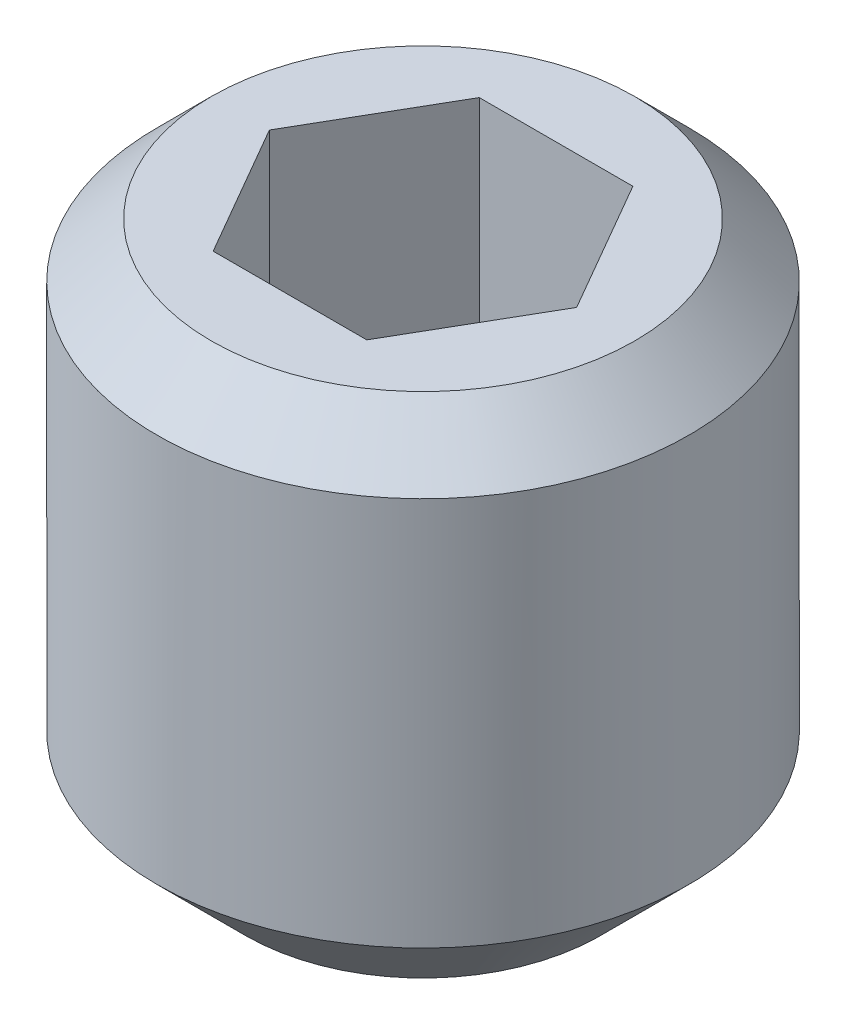
ISO-10303-21;
HEADER;
FILE_DESCRIPTION(('STEP AP214'),'2;1');
FILE_NAME('part.step','',(''),(''),'','','');
FILE_SCHEMA(('AUTOMOTIVE_DESIGN { 1 0 10303 214 1 1 1 1 }'));
ENDSEC;
DATA;
#1=APPLICATION_CONTEXT('core data for automotive mechanical design processes');
#2=APPLICATION_PROTOCOL_DEFINITION('international standard','automotive_design',2000,#1);
#3=PRODUCT_CONTEXT('',#1,'mechanical');
#4=PRODUCT('Part','Part','',(#3));
#5=PRODUCT_RELATED_PRODUCT_CATEGORY('part','',(#4));
#6=PRODUCT_DEFINITION_FORMATION('','',#4);
#7=PRODUCT_DEFINITION_CONTEXT('part definition',#1,'design');
#8=PRODUCT_DEFINITION('design','',#6,#7);
#9=PRODUCT_DEFINITION_SHAPE('','',#8);
#10=(LENGTH_UNIT() NAMED_UNIT(*) SI_UNIT(.MILLI.,.METRE.));
#11=(NAMED_UNIT(*) PLANE_ANGLE_UNIT() SI_UNIT($,.RADIAN.));
#12=(NAMED_UNIT(*) SI_UNIT($,.STERADIAN.) SOLID_ANGLE_UNIT());
#13=UNCERTAINTY_MEASURE_WITH_UNIT(LENGTH_MEASURE(1.E-05),#10,'distance_accuracy_value','');
#14=(GEOMETRIC_REPRESENTATION_CONTEXT(3) GLOBAL_UNCERTAINTY_ASSIGNED_CONTEXT((#13)) GLOBAL_UNIT_ASSIGNED_CONTEXT((#10,
#11,#12)) REPRESENTATION_CONTEXT('',''));
#15=CARTESIAN_POINT('',(0.,0.,0.));
#16=DIRECTION('',(0.,0.,1.));
#17=DIRECTION('',(1.,0.,0.));
#18=AXIS2_PLACEMENT_3D('',#15,#16,#17);
#19=CARTESIAN_POINT('',(0.,4.29999999983011,0.));
#20=DIRECTION('',(0.,1.,0.));
#21=DIRECTION('',(0.,0.,1.));
#22=AXIS2_PLACEMENT_3D('',#19,#20,#21);
#23=CONICAL_SURFACE('',#22,0.749999999811735,1.0471975507934);
#24=CARTESIAN_POINT('',(0.,4.29999999996138,0.));
#25=DIRECTION('',(0.,1.,0.));
#26=DIRECTION('',(0.,0.,1.));
#27=AXIS2_PLACEMENT_3D('',#24,#25,#26);
#28=CIRCLE('',#27,0.750000000039108);
#29=CARTESIAN_POINT('',(0.,4.29999999998069,0.750000000019554));
#30=VERTEX_POINT('',#29);
#31=CARTESIAN_POINT('',(-0.649519052855264,4.29999999998069,0.375000000009777));
#32=VERTEX_POINT('',#31);
#33=EDGE_CURVE('E141',#30,#32,#28,.F.);
#34=ORIENTED_EDGE('',*,*,#33,.F.);
#35=CARTESIAN_POINT('',(0.,4.29999999996138,0.));
#36=DIRECTION('',(0.,1.,0.));
#37=DIRECTION('',(0.,0.,1.));
#38=AXIS2_PLACEMENT_3D('',#35,#36,#37);
#39=CIRCLE('',#38,0.750000000039108);
#40=CARTESIAN_POINT('',(0.649519052855263,4.29999999998069,0.375000000009777));
#41=VERTEX_POINT('',#40);
#42=EDGE_CURVE('E144',#41,#30,#39,.F.);
#43=ORIENTED_EDGE('',*,*,#42,.F.);
#44=CARTESIAN_POINT('',(0.,4.29999999996138,0.));
#45=DIRECTION('',(0.,1.,0.));
#46=DIRECTION('',(0.,0.,1.));
#47=AXIS2_PLACEMENT_3D('',#44,#45,#46);
#48=CIRCLE('',#47,0.750000000039108);
#49=CARTESIAN_POINT('',(0.649519052855264,4.29999999998069,-0.375000000009777));
#50=VERTEX_POINT('',#49);
#51=EDGE_CURVE('E94',#50,#41,#48,.F.);
#52=ORIENTED_EDGE('',*,*,#51,.F.);
#53=CARTESIAN_POINT('',(0.,4.29999999996138,0.));
#54=DIRECTION('',(0.,1.,0.));
#55=DIRECTION('',(0.,0.,1.));
#56=AXIS2_PLACEMENT_3D('',#53,#54,#55);
#57=CIRCLE('',#56,0.750000000039108);
#58=CARTESIAN_POINT('',(0.,4.29999999998069,-0.750000000019554));
#59=VERTEX_POINT('',#58);
#60=EDGE_CURVE('E91',#59,#50,#57,.F.);
#61=ORIENTED_EDGE('',*,*,#60,.F.);
#62=CARTESIAN_POINT('',(0.,4.29999999996138,0.));
#63=DIRECTION('',(0.,1.,0.));
#64=DIRECTION('',(0.,0.,1.));
#65=AXIS2_PLACEMENT_3D('',#62,#63,#64);
#66=CIRCLE('',#65,0.750000000039108);
#67=CARTESIAN_POINT('',(-0.649519052855263,4.29999999998069,-0.375000000009777));
#68=VERTEX_POINT('',#67);
#69=EDGE_CURVE('E20',#68,#59,#66,.F.);
#70=ORIENTED_EDGE('',*,*,#69,.F.);
#71=CARTESIAN_POINT('',(0.,4.29999999996138,0.));
#72=DIRECTION('',(0.,1.,0.));
#73=DIRECTION('',(0.,0.,1.));
#74=AXIS2_PLACEMENT_3D('',#71,#72,#73);
#75=CIRCLE('',#74,0.750000000039108);
#76=EDGE_CURVE('E139',#32,#68,#75,.F.);
#77=ORIENTED_EDGE('',*,*,#76,.F.);
#78=EDGE_LOOP('',(#34,#43,#52,#61,#70,#77));
#79=FACE_BOUND('',#78,.T.);
#80=CARTESIAN_POINT('',(0.,3.86698729792556,2.55795384873636E-10));
#81=VERTEX_POINT('',#80);
#82=VERTEX_LOOP('',#81);
#83=FACE_BOUND('',#82,.T.);
#84=ADVANCED_FACE('F17',(#79,#83),#23,.F.);
#85=CARTESIAN_POINT('',(0.,4.3,0.));
#86=DIRECTION('',(0.,1.,0.));
#87=DIRECTION('',(0.,0.,1.));
#88=AXIS2_PLACEMENT_3D('',#85,#86,#87);
#89=PLANE('',#88);
#90=DIRECTION('',(-1.,0.,0.));
#91=VECTOR('',#90,1.);
#92=CARTESIAN_POINT('',(0.433012701892219,4.3,-0.75));
#93=LINE('',#92,#91);
#94=CARTESIAN_POINT('',(-0.433012701892219,4.3,-0.75));
#95=VERTEX_POINT('',#94);
#96=EDGE_CURVE('E102',#59,#95,#93,.T.);
#97=ORIENTED_EDGE('',*,*,#96,.T.);
#98=DIRECTION('',(-0.5,0.,0.866025403784439));
#99=VECTOR('',#98,1.);
#100=CARTESIAN_POINT('',(-0.433012701892219,4.3,-0.75));
#101=LINE('',#100,#99);
#102=EDGE_CURVE('E104',#95,#68,#101,.T.);
#103=ORIENTED_EDGE('',*,*,#102,.T.);
#104=ORIENTED_EDGE('',*,*,#69,.T.);
#105=EDGE_LOOP('',(#97,#103,#104));
#106=FACE_BOUND('',#105,.T.);
#107=ADVANCED_FACE('F100',(#106),#89,.T.);
#108=CARTESIAN_POINT('',(0.,4.3,0.));
#109=DIRECTION('',(0.,1.,0.));
#110=DIRECTION('',(0.,0.,1.));
#111=AXIS2_PLACEMENT_3D('',#108,#109,#110);
#112=PLANE('',#111);
#113=DIRECTION('',(-0.5,0.,-0.866025403784439));
#114=VECTOR('',#113,1.);
#115=CARTESIAN_POINT('',(0.866025403784439,4.3,0.));
#116=LINE('',#115,#114);
#117=CARTESIAN_POINT('',(0.43301270189222,4.3,-0.75));
#118=VERTEX_POINT('',#117);
#119=EDGE_CURVE('E110',#50,#118,#116,.T.);
#120=ORIENTED_EDGE('',*,*,#119,.T.);
#121=DIRECTION('',(-1.,0.,0.));
#122=VECTOR('',#121,1.);
#123=CARTESIAN_POINT('',(0.433012701892219,4.3,-0.75));
#124=LINE('',#123,#122);
#125=EDGE_CURVE('E107',#118,#59,#124,.T.);
#126=ORIENTED_EDGE('',*,*,#125,.T.);
#127=ORIENTED_EDGE('',*,*,#60,.T.);
#128=EDGE_LOOP('',(#120,#126,#127));
#129=FACE_BOUND('',#128,.T.);
#130=ADVANCED_FACE('F108',(#129),#112,.T.);
#131=CARTESIAN_POINT('',(0.,4.3,0.));
#132=DIRECTION('',(0.,1.,0.));
#133=DIRECTION('',(0.,0.,1.));
#134=AXIS2_PLACEMENT_3D('',#131,#132,#133);
#135=PLANE('',#134);
#136=DIRECTION('',(0.5,0.,-0.866025403784439));
#137=VECTOR('',#136,1.);
#138=CARTESIAN_POINT('',(0.433012701892219,4.3,0.75));
#139=LINE('',#138,#137);
#140=CARTESIAN_POINT('',(0.866025403784438,4.3,0.));
#141=VERTEX_POINT('',#140);
#142=EDGE_CURVE('E151',#41,#141,#139,.T.);
#143=ORIENTED_EDGE('',*,*,#142,.T.);
#144=DIRECTION('',(-0.5,0.,-0.866025403784439));
#145=VECTOR('',#144,1.);
#146=CARTESIAN_POINT('',(0.866025403784439,4.3,0.));
#147=LINE('',#146,#145);
#148=EDGE_CURVE('E153',#141,#50,#147,.T.);
#149=ORIENTED_EDGE('',*,*,#148,.T.);
#150=ORIENTED_EDGE('',*,*,#51,.T.);
#151=EDGE_LOOP('',(#143,#149,#150));
#152=FACE_BOUND('',#151,.T.);
#153=ADVANCED_FACE('F149',(#152),#135,.T.);
#154=CARTESIAN_POINT('',(0.,4.3,0.));
#155=DIRECTION('',(0.,1.,0.));
#156=DIRECTION('',(0.,0.,1.));
#157=AXIS2_PLACEMENT_3D('',#154,#155,#156);
#158=PLANE('',#157);
#159=DIRECTION('',(1.,0.,0.));
#160=VECTOR('',#159,1.);
#161=CARTESIAN_POINT('',(-0.433012701892219,4.3,0.75));
#162=LINE('',#161,#160);
#163=CARTESIAN_POINT('',(0.433012701892219,4.3,0.75));
#164=VERTEX_POINT('',#163);
#165=EDGE_CURVE('E160',#30,#164,#162,.T.);
#166=ORIENTED_EDGE('',*,*,#165,.T.);
#167=DIRECTION('',(0.5,0.,-0.866025403784439));
#168=VECTOR('',#167,1.);
#169=CARTESIAN_POINT('',(0.433012701892219,4.3,0.75));
#170=LINE('',#169,#168);
#171=EDGE_CURVE('E156',#164,#41,#170,.T.);
#172=ORIENTED_EDGE('',*,*,#171,.T.);
#173=ORIENTED_EDGE('',*,*,#42,.T.);
#174=EDGE_LOOP('',(#166,#172,#173));
#175=FACE_BOUND('',#174,.T.);
#176=ADVANCED_FACE('F157',(#175),#158,.T.);
#177=CARTESIAN_POINT('',(0.,4.3,0.));
#178=DIRECTION('',(0.,1.,0.));
#179=DIRECTION('',(0.,0.,1.));
#180=AXIS2_PLACEMENT_3D('',#177,#178,#179);
#181=PLANE('',#180);
#182=DIRECTION('',(0.5,0.,0.866025403784439));
#183=VECTOR('',#182,1.);
#184=CARTESIAN_POINT('',(-0.866025403784439,4.3,0.));
#185=LINE('',#184,#183);
#186=CARTESIAN_POINT('',(-0.43301270189222,4.3,0.75));
#187=VERTEX_POINT('',#186);
#188=EDGE_CURVE('E209',#32,#187,#185,.T.);
#189=ORIENTED_EDGE('',*,*,#188,.T.);
#190=DIRECTION('',(1.,0.,0.));
#191=VECTOR('',#190,1.);
#192=CARTESIAN_POINT('',(-0.433012701892219,4.3,0.75));
#193=LINE('',#192,#191);
#194=EDGE_CURVE('E211',#187,#30,#193,.T.);
#195=ORIENTED_EDGE('',*,*,#194,.T.);
#196=ORIENTED_EDGE('',*,*,#33,.T.);
#197=EDGE_LOOP('',(#189,#195,#196));
#198=FACE_BOUND('',#197,.T.);
#199=ADVANCED_FACE('F255',(#198),#181,.T.);
#200=CARTESIAN_POINT('',(0.,4.3,0.));
#201=DIRECTION('',(0.,1.,0.));
#202=DIRECTION('',(0.,0.,1.));
#203=AXIS2_PLACEMENT_3D('',#200,#201,#202);
#204=PLANE('',#203);
#205=DIRECTION('',(-0.5,0.,0.866025403784439));
#206=VECTOR('',#205,1.);
#207=CARTESIAN_POINT('',(-0.433012701892219,4.3,-0.75));
#208=LINE('',#207,#206);
#209=CARTESIAN_POINT('',(-0.866025403784439,4.3,0.));
#210=VERTEX_POINT('',#209);
#211=EDGE_CURVE('E120',#68,#210,#208,.T.);
#212=ORIENTED_EDGE('',*,*,#211,.T.);
#213=DIRECTION('',(0.5,0.,0.866025403784439));
#214=VECTOR('',#213,1.);
#215=CARTESIAN_POINT('',(-0.866025403784439,4.3,0.));
#216=LINE('',#215,#214);
#217=EDGE_CURVE('E203',#210,#32,#216,.T.);
#218=ORIENTED_EDGE('',*,*,#217,.T.);
#219=ORIENTED_EDGE('',*,*,#76,.T.);
#220=EDGE_LOOP('',(#212,#218,#219));
#221=FACE_BOUND('',#220,.T.);
#222=ADVANCED_FACE('F253',(#221),#204,.T.);
#223=CARTESIAN_POINT('',(-0.433012701892219,5.5,-0.75));
#224=DIRECTION('',(-0.866025403784439,0.,-0.5));
#225=DIRECTION('',(-0.5,0.,0.866025403784439));
#226=AXIS2_PLACEMENT_3D('',#223,#224,#225);
#227=PLANE('',#226);
#228=DIRECTION('',(0.,1.,0.));
#229=VECTOR('',#228,1.);
#230=CARTESIAN_POINT('',(-0.433012701892219,5.5,-0.75));
#231=LINE('',#230,#229);
#232=CARTESIAN_POINT('',(-0.433012701892219,5.5,-0.75));
#233=VERTEX_POINT('',#232);
#234=EDGE_CURVE('E113',#95,#233,#231,.T.);
#235=ORIENTED_EDGE('',*,*,#234,.T.);
#236=DIRECTION('',(0.500000000000001,0.,-0.866025403784438));
#237=VECTOR('',#236,1.);
#238=CARTESIAN_POINT('',(-0.866025403784439,5.5,0.));
#239=LINE('',#238,#237);
#240=CARTESIAN_POINT('',(-0.866025403784439,5.5,0.));
#241=VERTEX_POINT('',#240);
#242=EDGE_CURVE('E201',#241,#233,#239,.T.);
#243=ORIENTED_EDGE('',*,*,#242,.F.);
#244=DIRECTION('',(0.,1.,0.));
#245=VECTOR('',#244,1.);
#246=CARTESIAN_POINT('',(-0.866025403784439,5.5,0.));
#247=LINE('',#246,#245);
#248=EDGE_CURVE('E216',#241,#210,#247,.F.);
#249=ORIENTED_EDGE('',*,*,#248,.T.);
#250=ORIENTED_EDGE('',*,*,#211,.F.);
#251=ORIENTED_EDGE('',*,*,#102,.F.);
#252=EDGE_LOOP('',(#235,#243,#249,#250,#251));
#253=FACE_BOUND('',#252,.T.);
#254=ADVANCED_FACE('F251',(#253),#227,.F.);
#255=CARTESIAN_POINT('',(0.433012701892219,5.5,-0.75));
#256=DIRECTION('',(0.,0.,-1.));
#257=DIRECTION('',(-1.,0.,0.));
#258=AXIS2_PLACEMENT_3D('',#255,#256,#257);
#259=PLANE('',#258);
#260=DIRECTION('',(0.,1.,0.));
#261=VECTOR('',#260,1.);
#262=CARTESIAN_POINT('',(0.43301270189222,5.5,-0.75));
#263=LINE('',#262,#261);
#264=CARTESIAN_POINT('',(0.433012701892219,5.5,-0.75));
#265=VERTEX_POINT('',#264);
#266=EDGE_CURVE('E170',#118,#265,#263,.T.);
#267=ORIENTED_EDGE('',*,*,#266,.T.);
#268=DIRECTION('',(1.,0.,0.));
#269=VECTOR('',#268,1.);
#270=CARTESIAN_POINT('',(0.,5.5,-0.75));
#271=LINE('',#270,#269);
#272=EDGE_CURVE('E188',#233,#265,#271,.T.);
#273=ORIENTED_EDGE('',*,*,#272,.F.);
#274=ORIENTED_EDGE('',*,*,#234,.F.);
#275=ORIENTED_EDGE('',*,*,#96,.F.);
#276=ORIENTED_EDGE('',*,*,#125,.F.);
#277=EDGE_LOOP('',(#267,#273,#274,#275,#276));
#278=FACE_BOUND('',#277,.T.);
#279=ADVANCED_FACE('F116',(#278),#259,.F.);
#280=CARTESIAN_POINT('',(0.866025403784439,5.5,0.));
#281=DIRECTION('',(0.866025403784439,0.,-0.5));
#282=DIRECTION('',(-0.5,0.,-0.866025403784439));
#283=AXIS2_PLACEMENT_3D('',#280,#281,#282);
#284=PLANE('',#283);
#285=DIRECTION('',(0.,1.,0.));
#286=VECTOR('',#285,1.);
#287=CARTESIAN_POINT('',(0.866025403784438,5.5,0.));
#288=LINE('',#287,#286);
#289=CARTESIAN_POINT('',(0.866025403784439,5.5,0.));
#290=VERTEX_POINT('',#289);
#291=EDGE_CURVE('E163',#141,#290,#288,.T.);
#292=ORIENTED_EDGE('',*,*,#291,.T.);
#293=DIRECTION('',(0.500000000000001,0.,0.866025403784438));
#294=VECTOR('',#293,1.);
#295=CARTESIAN_POINT('',(0.433012701892219,5.5,-0.75));
#296=LINE('',#295,#294);
#297=EDGE_CURVE('E192',#265,#290,#296,.T.);
#298=ORIENTED_EDGE('',*,*,#297,.F.);
#299=ORIENTED_EDGE('',*,*,#266,.F.);
#300=ORIENTED_EDGE('',*,*,#119,.F.);
#301=ORIENTED_EDGE('',*,*,#148,.F.);
#302=EDGE_LOOP('',(#292,#298,#299,#300,#301));
#303=FACE_BOUND('',#302,.T.);
#304=ADVANCED_FACE('F193',(#303),#284,.F.);
#305=CARTESIAN_POINT('',(0.433012701892219,5.5,0.75));
#306=DIRECTION('',(0.866025403784439,0.,0.5));
#307=DIRECTION('',(0.5,0.,-0.866025403784439));
#308=AXIS2_PLACEMENT_3D('',#305,#306,#307);
#309=PLANE('',#308);
#310=DIRECTION('',(0.,1.,0.));
#311=VECTOR('',#310,1.);
#312=CARTESIAN_POINT('',(0.433012701892219,5.5,0.75));
#313=LINE('',#312,#311);
#314=CARTESIAN_POINT('',(0.433012701892219,5.5,0.75));
#315=VERTEX_POINT('',#314);
#316=EDGE_CURVE('E233',#164,#315,#313,.T.);
#317=ORIENTED_EDGE('',*,*,#316,.T.);
#318=DIRECTION('',(-0.500000000000001,0.,0.866025403784438));
#319=VECTOR('',#318,1.);
#320=CARTESIAN_POINT('',(0.866025403784439,5.5,0.));
#321=LINE('',#320,#319);
#322=EDGE_CURVE('E196',#290,#315,#321,.T.);
#323=ORIENTED_EDGE('',*,*,#322,.F.);
#324=ORIENTED_EDGE('',*,*,#291,.F.);
#325=ORIENTED_EDGE('',*,*,#142,.F.);
#326=ORIENTED_EDGE('',*,*,#171,.F.);
#327=EDGE_LOOP('',(#317,#323,#324,#325,#326));
#328=FACE_BOUND('',#327,.T.);
#329=ADVANCED_FACE('F166',(#328),#309,.F.);
#330=CARTESIAN_POINT('',(-0.433012701892219,5.5,0.75));
#331=DIRECTION('',(0.,0.,1.));
#332=DIRECTION('',(1.,0.,0.));
#333=AXIS2_PLACEMENT_3D('',#330,#331,#332);
#334=PLANE('',#333);
#335=DIRECTION('',(0.,1.,0.));
#336=VECTOR('',#335,1.);
#337=CARTESIAN_POINT('',(-0.43301270189222,5.5,0.75));
#338=LINE('',#337,#336);
#339=CARTESIAN_POINT('',(-0.433012701892219,5.5,0.75));
#340=VERTEX_POINT('',#339);
#341=EDGE_CURVE('E35',#187,#340,#338,.T.);
#342=ORIENTED_EDGE('',*,*,#341,.T.);
#343=DIRECTION('',(1.,0.,0.));
#344=VECTOR('',#343,1.);
#345=CARTESIAN_POINT('',(0.,5.5,0.75));
#346=LINE('',#345,#344);
#347=EDGE_CURVE('E229',#315,#340,#346,.F.);
#348=ORIENTED_EDGE('',*,*,#347,.F.);
#349=ORIENTED_EDGE('',*,*,#316,.F.);
#350=ORIENTED_EDGE('',*,*,#165,.F.);
#351=ORIENTED_EDGE('',*,*,#194,.F.);
#352=EDGE_LOOP('',(#342,#348,#349,#350,#351));
#353=FACE_BOUND('',#352,.T.);
#354=ADVANCED_FACE('F243',(#353),#334,.F.);
#355=CARTESIAN_POINT('',(-0.866025403784439,5.5,0.));
#356=DIRECTION('',(-0.866025403784439,0.,0.5));
#357=DIRECTION('',(0.5,0.,0.866025403784439));
#358=AXIS2_PLACEMENT_3D('',#355,#356,#357);
#359=PLANE('',#358);
#360=ORIENTED_EDGE('',*,*,#248,.F.);
#361=DIRECTION('',(-0.500000000000001,0.,-0.866025403784438));
#362=VECTOR('',#361,1.);
#363=CARTESIAN_POINT('',(-0.433012701892219,5.5,0.75));
#364=LINE('',#363,#362);
#365=EDGE_CURVE('E138',#340,#241,#364,.T.);
#366=ORIENTED_EDGE('',*,*,#365,.F.);
#367=ORIENTED_EDGE('',*,*,#341,.F.);
#368=ORIENTED_EDGE('',*,*,#188,.F.);
#369=ORIENTED_EDGE('',*,*,#217,.F.);
#370=EDGE_LOOP('',(#360,#366,#367,#368,#369));
#371=FACE_BOUND('',#370,.T.);
#372=ADVANCED_FACE('F247',(#371),#359,.F.);
#373=CARTESIAN_POINT('',(0.,2.5,0.5));
#374=DIRECTION('',(0.,-1.,0.));
#375=DIRECTION('',(0.,0.,-1.));
#376=AXIS2_PLACEMENT_3D('',#373,#374,#375);
#377=PLANE('',#376);
#378=CARTESIAN_POINT('',(0.,2.49999999994088,0.));
#379=DIRECTION('',(0.,1.,0.));
#380=DIRECTION('',(0.,0.,1.));
#381=AXIS2_PLACEMENT_3D('',#378,#379,#380);
#382=CIRCLE('',#381,1.0000000000332);
#383=CARTESIAN_POINT('',(0.,2.49999999994088,1.0000000000332));
#384=VERTEX_POINT('',#383);
#385=EDGE_CURVE('E135',#384,#384,#382,.T.);
#386=ORIENTED_EDGE('',*,*,#385,.F.);
#387=EDGE_LOOP('',(#386));
#388=FACE_BOUND('',#387,.T.);
#389=ADVANCED_FACE('F283',(#388),#377,.T.);
#390=CARTESIAN_POINT('',(0.,5.5,0.59675));
#391=DIRECTION('',(0.,1.,0.));
#392=DIRECTION('',(0.,0.,1.));
#393=AXIS2_PLACEMENT_3D('',#390,#391,#392);
#394=PLANE('',#393);
#395=CARTESIAN_POINT('',(0.,5.50000000004047,0.));
#396=DIRECTION('',(0.,-1.,0.));
#397=DIRECTION('',(0.,0.,-1.));
#398=AXIS2_PLACEMENT_3D('',#395,#396,#397);
#399=CIRCLE('',#398,1.1934999999994);
#400=CARTESIAN_POINT('',(0.,5.50000000004047,-1.1934999999994));
#401=VERTEX_POINT('',#400);
#402=EDGE_CURVE('E132',#401,#401,#399,.T.);
#403=ORIENTED_EDGE('',*,*,#402,.F.);
#404=EDGE_LOOP('',(#403));
#405=FACE_BOUND('',#404,.T.);
#406=ORIENTED_EDGE('',*,*,#347,.T.);
#407=ORIENTED_EDGE('',*,*,#365,.T.);
#408=ORIENTED_EDGE('',*,*,#242,.T.);
#409=ORIENTED_EDGE('',*,*,#272,.T.);
#410=ORIENTED_EDGE('',*,*,#297,.T.);
#411=ORIENTED_EDGE('',*,*,#322,.T.);
#412=EDGE_LOOP('',(#406,#407,#408,#409,#410,#411));
#413=FACE_BOUND('',#412,.T.);
#414=ADVANCED_FACE('F199',(#405,#413),#394,.T.);
#415=CARTESIAN_POINT('',(0.,2.99999999992906,0.));
#416=DIRECTION('',(0.,1.,0.));
#417=DIRECTION('',(0.,0.,1.));
#418=AXIS2_PLACEMENT_3D('',#415,#416,#417);
#419=CONICAL_SURFACE('',#418,1.50000000002137,0.785398163397448);
#420=ORIENTED_EDGE('',*,*,#385,.T.);
#421=EDGE_LOOP('',(#420));
#422=FACE_BOUND('',#421,.T.);
#423=CARTESIAN_POINT('',(0.,3.,0.));
#424=DIRECTION('',(0.,-1.,0.));
#425=DIRECTION('',(0.,0.,-1.));
#426=AXIS2_PLACEMENT_3D('',#423,#424,#425);
#427=CIRCLE('',#426,1.5);
#428=CARTESIAN_POINT('',(0.,3.,-1.5));
#429=VERTEX_POINT('',#428);
#430=EDGE_CURVE('E26',#429,#429,#427,.F.);
#431=ORIENTED_EDGE('',*,*,#430,.F.);
#432=EDGE_LOOP('',(#431));
#433=FACE_BOUND('',#432,.T.);
#434=ADVANCED_FACE('F273',(#422,#433),#419,.T.);
#435=CARTESIAN_POINT('',(0.,5.19350000007535,0.));
#436=DIRECTION('',(0.,-1.,0.));
#437=DIRECTION('',(0.,0.,-1.));
#438=AXIS2_PLACEMENT_3D('',#435,#436,#437);
#439=CONICAL_SURFACE('',#438,1.49999999996453,0.785398163397448);
#440=ORIENTED_EDGE('',*,*,#402,.T.);
#441=EDGE_LOOP('',(#440));
#442=FACE_BOUND('',#441,.T.);
#443=CARTESIAN_POINT('',(0.,5.1935,0.));
#444=DIRECTION('',(0.,-1.,0.));
#445=DIRECTION('',(0.,0.,-1.));
#446=AXIS2_PLACEMENT_3D('',#443,#444,#445);
#447=CIRCLE('',#446,1.5);
#448=CARTESIAN_POINT('',(0.,5.1935,-1.5));
#449=VERTEX_POINT('',#448);
#450=EDGE_CURVE('E11',#449,#449,#447,.T.);
#451=ORIENTED_EDGE('',*,*,#450,.F.);
#452=EDGE_LOOP('',(#451));
#453=FACE_BOUND('',#452,.T.);
#454=ADVANCED_FACE('F267',(#442,#453),#439,.T.);
#455=CARTESIAN_POINT('',(0.,4.09675,0.));
#456=DIRECTION('',(0.,-1.,0.));
#457=DIRECTION('',(0.,0.,-1.));
#458=AXIS2_PLACEMENT_3D('',#455,#456,#457);
#459=CYLINDRICAL_SURFACE('',#458,1.5);
#460=ORIENTED_EDGE('',*,*,#430,.T.);
#461=EDGE_LOOP('',(#460));
#462=FACE_BOUND('',#461,.T.);
#463=ORIENTED_EDGE('',*,*,#450,.T.);
#464=EDGE_LOOP('',(#463));
#465=FACE_BOUND('',#464,.T.);
#466=ADVANCED_FACE('F265',(#462,#465),#459,.T.);
#467=CLOSED_SHELL('',(#84,#107,#130,#153,#176,#199,#222,#254,#279,#304,#329,#354,#372,#389,#414,
#434,#454,#466));
#468=MANIFOLD_SOLID_BREP('B1',#467);
#469=ADVANCED_BREP_SHAPE_REPRESENTATION('',(#18,#468),#14);
#470=SHAPE_DEFINITION_REPRESENTATION(#9,#469);
ENDSEC;
END-ISO-10303-21;
